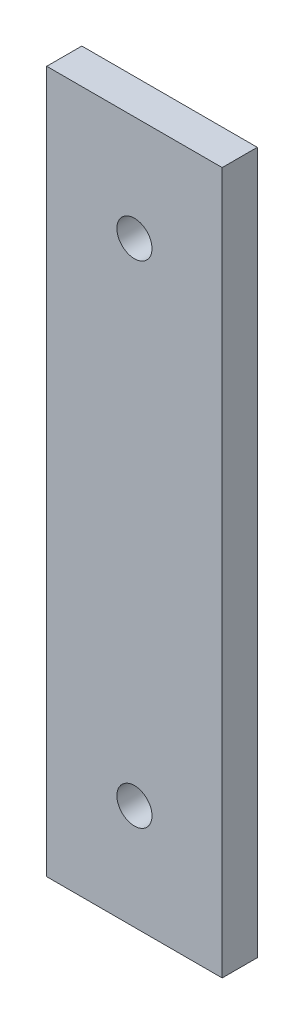
ISO-10303-21;
HEADER;
FILE_DESCRIPTION(('STEP AP214'),'2;1');
FILE_NAME('part.step','',(''),(''),'','','');
FILE_SCHEMA(('AUTOMOTIVE_DESIGN { 1 0 10303 214 1 1 1 1 }'));
ENDSEC;
DATA;
#1=APPLICATION_CONTEXT('core data for automotive mechanical design processes');
#2=APPLICATION_PROTOCOL_DEFINITION('international standard','automotive_design',2000,#1);
#3=PRODUCT_CONTEXT('',#1,'mechanical');
#4=PRODUCT('Part','Part','',(#3));
#5=PRODUCT_RELATED_PRODUCT_CATEGORY('part','',(#4));
#6=PRODUCT_DEFINITION_FORMATION('','',#4);
#7=PRODUCT_DEFINITION_CONTEXT('part definition',#1,'design');
#8=PRODUCT_DEFINITION('design','',#6,#7);
#9=PRODUCT_DEFINITION_SHAPE('','',#8);
#10=(LENGTH_UNIT() NAMED_UNIT(*) SI_UNIT(.MILLI.,.METRE.));
#11=(NAMED_UNIT(*) PLANE_ANGLE_UNIT() SI_UNIT($,.RADIAN.));
#12=(NAMED_UNIT(*) SI_UNIT($,.STERADIAN.) SOLID_ANGLE_UNIT());
#13=UNCERTAINTY_MEASURE_WITH_UNIT(LENGTH_MEASURE(1.E-05),#10,'distance_accuracy_value','');
#14=(GEOMETRIC_REPRESENTATION_CONTEXT(3) GLOBAL_UNCERTAINTY_ASSIGNED_CONTEXT((#13)) GLOBAL_UNIT_ASSIGNED_CONTEXT((#10,
#11,#12)) REPRESENTATION_CONTEXT('',''));
#15=CARTESIAN_POINT('',(0.,0.,0.));
#16=DIRECTION('',(0.,0.,1.));
#17=DIRECTION('',(1.,0.,0.));
#18=AXIS2_PLACEMENT_3D('',#15,#16,#17);
#19=CARTESIAN_POINT('',(0.,65.1595744680851,5.));
#20=DIRECTION('',(1.,0.,0.));
#21=DIRECTION('',(0.,1.,0.));
#22=AXIS2_PLACEMENT_3D('',#19,#20,#21);
#23=PLANE('',#22);
#24=DIRECTION('',(0.,-1.,0.));
#25=VECTOR('',#24,1.);
#26=CARTESIAN_POINT('',(0.,65.1595744680851,0.));
#27=LINE('',#26,#25);
#28=CARTESIAN_POINT('',(0.,65.1595744680851,0.));
#29=VERTEX_POINT('',#28);
#30=CARTESIAN_POINT('',(0.,-34.8404255319149,0.));
#31=VERTEX_POINT('',#30);
#32=EDGE_CURVE('E98',#29,#31,#27,.T.);
#33=ORIENTED_EDGE('',*,*,#32,.T.);
#34=DIRECTION('',(0.,0.,-1.));
#35=VECTOR('',#34,1.);
#36=CARTESIAN_POINT('',(0.,-34.8404255319149,5.));
#37=LINE('',#36,#35);
#38=CARTESIAN_POINT('',(0.,-34.8404255319149,5.));
#39=VERTEX_POINT('',#38);
#40=EDGE_CURVE('E11',#39,#31,#37,.T.);
#41=ORIENTED_EDGE('',*,*,#40,.F.);
#42=DIRECTION('',(0.,-1.,0.));
#43=VECTOR('',#42,1.);
#44=CARTESIAN_POINT('',(0.,65.1595744680851,5.));
#45=LINE('',#44,#43);
#46=CARTESIAN_POINT('',(0.,65.1595744680851,5.));
#47=VERTEX_POINT('',#46);
#48=EDGE_CURVE('E85',#47,#39,#45,.T.);
#49=ORIENTED_EDGE('',*,*,#48,.F.);
#50=DIRECTION('',(0.,0.,-1.));
#51=VECTOR('',#50,1.);
#52=CARTESIAN_POINT('',(0.,65.1595744680851,5.));
#53=LINE('',#52,#51);
#54=EDGE_CURVE('E94',#47,#29,#53,.T.);
#55=ORIENTED_EDGE('',*,*,#54,.T.);
#56=EDGE_LOOP('',(#33,#41,#49,#55));
#57=FACE_BOUND('',#56,.T.);
#58=ADVANCED_FACE('F32',(#57),#23,.F.);
#59=CARTESIAN_POINT('',(0.,-34.8404255319149,5.));
#60=DIRECTION('',(0.,1.,0.));
#61=DIRECTION('',(0.,0.,1.));
#62=AXIS2_PLACEMENT_3D('',#59,#60,#61);
#63=PLANE('',#62);
#64=DIRECTION('',(1.,0.,0.));
#65=VECTOR('',#64,1.);
#66=CARTESIAN_POINT('',(0.,-34.8404255319149,0.));
#67=LINE('',#66,#65);
#68=CARTESIAN_POINT('',(25.,-34.8404255319149,0.));
#69=VERTEX_POINT('',#68);
#70=EDGE_CURVE('E89',#31,#69,#67,.T.);
#71=ORIENTED_EDGE('',*,*,#70,.T.);
#72=DIRECTION('',(0.,0.,-1.));
#73=VECTOR('',#72,1.);
#74=CARTESIAN_POINT('',(25.,-34.8404255319149,5.));
#75=LINE('',#74,#73);
#76=CARTESIAN_POINT('',(25.,-34.8404255319149,5.));
#77=VERTEX_POINT('',#76);
#78=EDGE_CURVE('E41',#77,#69,#75,.T.);
#79=ORIENTED_EDGE('',*,*,#78,.F.);
#80=DIRECTION('',(1.,0.,0.));
#81=VECTOR('',#80,1.);
#82=CARTESIAN_POINT('',(0.,-34.8404255319149,5.));
#83=LINE('',#82,#81);
#84=EDGE_CURVE('E80',#39,#77,#83,.T.);
#85=ORIENTED_EDGE('',*,*,#84,.F.);
#86=ORIENTED_EDGE('',*,*,#40,.T.);
#87=EDGE_LOOP('',(#71,#79,#85,#86));
#88=FACE_BOUND('',#87,.T.);
#89=ADVANCED_FACE('F88',(#88),#63,.F.);
#90=CARTESIAN_POINT('',(25.,65.1595744680851,5.));
#91=DIRECTION('',(-1.,0.,0.));
#92=DIRECTION('',(0.,-1.,0.));
#93=AXIS2_PLACEMENT_3D('',#90,#91,#92);
#94=PLANE('',#93);
#95=DIRECTION('',(0.,1.,0.));
#96=VECTOR('',#95,1.);
#97=CARTESIAN_POINT('',(25.,65.1595744680851,0.));
#98=LINE('',#97,#96);
#99=CARTESIAN_POINT('',(25.,65.1595744680851,0.));
#100=VERTEX_POINT('',#99);
#101=EDGE_CURVE('E67',#69,#100,#98,.T.);
#102=ORIENTED_EDGE('',*,*,#101,.T.);
#103=DIRECTION('',(0.,0.,-1.));
#104=VECTOR('',#103,1.);
#105=CARTESIAN_POINT('',(25.,65.1595744680851,5.));
#106=LINE('',#105,#104);
#107=CARTESIAN_POINT('',(25.,65.1595744680851,5.));
#108=VERTEX_POINT('',#107);
#109=EDGE_CURVE('E90',#108,#100,#106,.T.);
#110=ORIENTED_EDGE('',*,*,#109,.F.);
#111=DIRECTION('',(0.,1.,0.));
#112=VECTOR('',#111,1.);
#113=CARTESIAN_POINT('',(25.,65.1595744680851,5.));
#114=LINE('',#113,#112);
#115=EDGE_CURVE('E83',#77,#108,#114,.T.);
#116=ORIENTED_EDGE('',*,*,#115,.F.);
#117=ORIENTED_EDGE('',*,*,#78,.T.);
#118=EDGE_LOOP('',(#102,#110,#116,#117));
#119=FACE_BOUND('',#118,.T.);
#120=ADVANCED_FACE('F92',(#119),#94,.F.);
#121=CARTESIAN_POINT('',(0.,65.1595744680851,5.));
#122=DIRECTION('',(0.,-1.,0.));
#123=DIRECTION('',(0.,0.,-1.));
#124=AXIS2_PLACEMENT_3D('',#121,#122,#123);
#125=PLANE('',#124);
#126=DIRECTION('',(-1.,0.,0.));
#127=VECTOR('',#126,1.);
#128=CARTESIAN_POINT('',(0.,65.1595744680851,0.));
#129=LINE('',#128,#127);
#130=EDGE_CURVE('E73',#100,#29,#129,.T.);
#131=ORIENTED_EDGE('',*,*,#130,.T.);
#132=ORIENTED_EDGE('',*,*,#54,.F.);
#133=DIRECTION('',(-1.,0.,0.));
#134=VECTOR('',#133,1.);
#135=CARTESIAN_POINT('',(0.,65.1595744680851,5.));
#136=LINE('',#135,#134);
#137=EDGE_CURVE('E50',#108,#47,#136,.T.);
#138=ORIENTED_EDGE('',*,*,#137,.F.);
#139=ORIENTED_EDGE('',*,*,#109,.T.);
#140=EDGE_LOOP('',(#131,#132,#138,#139));
#141=FACE_BOUND('',#140,.T.);
#142=ADVANCED_FACE('F126',(#141),#125,.F.);
#143=CARTESIAN_POINT('',(0.,0.,5.));
#144=DIRECTION('',(0.,0.,1.));
#145=DIRECTION('',(1.,0.,0.));
#146=AXIS2_PLACEMENT_3D('',#143,#144,#145);
#147=PLANE('',#146);
#148=CARTESIAN_POINT('',(12.5,-19.8404255319149,5.));
#149=DIRECTION('',(0.,0.,1.));
#150=DIRECTION('',(1.,0.,0.));
#151=AXIS2_PLACEMENT_3D('',#148,#149,#150);
#152=CIRCLE('',#151,2.5);
#153=CARTESIAN_POINT('',(15.,-19.8404255319149,5.));
#154=VERTEX_POINT('',#153);
#155=EDGE_CURVE('E115',#154,#154,#152,.T.);
#156=ORIENTED_EDGE('',*,*,#155,.F.);
#157=EDGE_LOOP('',(#156));
#158=FACE_BOUND('',#157,.T.);
#159=CARTESIAN_POINT('',(12.5,50.1595744680851,5.));
#160=DIRECTION('',(0.,0.,1.));
#161=DIRECTION('',(1.,0.,0.));
#162=AXIS2_PLACEMENT_3D('',#159,#160,#161);
#163=CIRCLE('',#162,2.5);
#164=CARTESIAN_POINT('',(15.,50.1595744680851,5.));
#165=VERTEX_POINT('',#164);
#166=EDGE_CURVE('E107',#165,#165,#163,.T.);
#167=ORIENTED_EDGE('',*,*,#166,.F.);
#168=EDGE_LOOP('',(#167));
#169=FACE_BOUND('',#168,.T.);
#170=ORIENTED_EDGE('',*,*,#48,.T.);
#171=ORIENTED_EDGE('',*,*,#84,.T.);
#172=ORIENTED_EDGE('',*,*,#115,.T.);
#173=ORIENTED_EDGE('',*,*,#137,.T.);
#174=EDGE_LOOP('',(#170,#171,#172,#173));
#175=FACE_BOUND('',#174,.T.);
#176=ADVANCED_FACE('F81',(#158,#169,#175),#147,.T.);
#177=CARTESIAN_POINT('',(0.,0.,0.));
#178=DIRECTION('',(0.,0.,1.));
#179=DIRECTION('',(1.,0.,0.));
#180=AXIS2_PLACEMENT_3D('',#177,#178,#179);
#181=PLANE('',#180);
#182=CARTESIAN_POINT('',(12.5,-19.8404255319149,0.));
#183=DIRECTION('',(0.,0.,1.));
#184=DIRECTION('',(1.,0.,0.));
#185=AXIS2_PLACEMENT_3D('',#182,#183,#184);
#186=CIRCLE('',#185,2.5);
#187=CARTESIAN_POINT('',(15.,-19.8404255319149,0.));
#188=VERTEX_POINT('',#187);
#189=EDGE_CURVE('E35',#188,#188,#186,.T.);
#190=ORIENTED_EDGE('',*,*,#189,.T.);
#191=EDGE_LOOP('',(#190));
#192=FACE_BOUND('',#191,.T.);
#193=CARTESIAN_POINT('',(12.5,50.1595744680851,0.));
#194=DIRECTION('',(0.,0.,1.));
#195=DIRECTION('',(1.,0.,0.));
#196=AXIS2_PLACEMENT_3D('',#193,#194,#195);
#197=CIRCLE('',#196,2.5);
#198=CARTESIAN_POINT('',(15.,50.1595744680851,0.));
#199=VERTEX_POINT('',#198);
#200=EDGE_CURVE('E101',#199,#199,#197,.T.);
#201=ORIENTED_EDGE('',*,*,#200,.T.);
#202=EDGE_LOOP('',(#201));
#203=FACE_BOUND('',#202,.T.);
#204=ORIENTED_EDGE('',*,*,#32,.F.);
#205=ORIENTED_EDGE('',*,*,#130,.F.);
#206=ORIENTED_EDGE('',*,*,#101,.F.);
#207=ORIENTED_EDGE('',*,*,#70,.F.);
#208=EDGE_LOOP('',(#204,#205,#206,#207));
#209=FACE_BOUND('',#208,.T.);
#210=ADVANCED_FACE('F125',(#192,#203,#209),#181,.F.);
#211=CARTESIAN_POINT('',(12.5,50.1595744680851,-5.));
#212=DIRECTION('',(0.,0.,1.));
#213=DIRECTION('',(1.,0.,0.));
#214=AXIS2_PLACEMENT_3D('',#211,#212,#213);
#215=CYLINDRICAL_SURFACE('',#214,2.5);
#216=ORIENTED_EDGE('',*,*,#166,.T.);
#217=EDGE_LOOP('',(#216));
#218=FACE_BOUND('',#217,.T.);
#219=ORIENTED_EDGE('',*,*,#200,.F.);
#220=EDGE_LOOP('',(#219));
#221=FACE_BOUND('',#220,.T.);
#222=ADVANCED_FACE('F132',(#218,#221),#215,.F.);
#223=CARTESIAN_POINT('',(12.5,-19.8404255319149,-5.));
#224=DIRECTION('',(0.,0.,1.));
#225=DIRECTION('',(1.,0.,0.));
#226=AXIS2_PLACEMENT_3D('',#223,#224,#225);
#227=CYLINDRICAL_SURFACE('',#226,2.5);
#228=ORIENTED_EDGE('',*,*,#155,.T.);
#229=EDGE_LOOP('',(#228));
#230=FACE_BOUND('',#229,.T.);
#231=ORIENTED_EDGE('',*,*,#189,.F.);
#232=EDGE_LOOP('',(#231));
#233=FACE_BOUND('',#232,.T.);
#234=ADVANCED_FACE('F120',(#230,#233),#227,.F.);
#235=CLOSED_SHELL('',(#58,#89,#120,#142,#176,#210,#222,#234));
#236=MANIFOLD_SOLID_BREP('B2',#235);
#237=ADVANCED_BREP_SHAPE_REPRESENTATION('',(#18,#236),#14);
#238=SHAPE_DEFINITION_REPRESENTATION(#9,#237);
ENDSEC;
END-ISO-10303-21;
